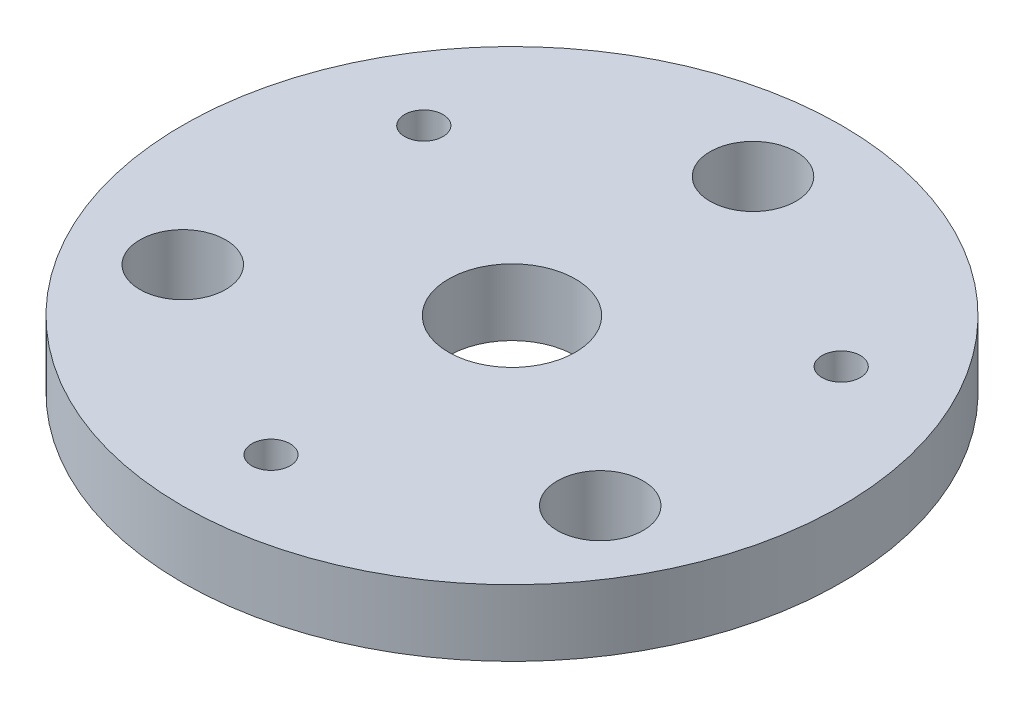
ISO-10303-21;
HEADER;
FILE_DESCRIPTION(('STEP AP214'),'2;1');
FILE_NAME('part.step','',(''),(''),'','','');
FILE_SCHEMA(('AUTOMOTIVE_DESIGN { 1 0 10303 214 1 1 1 1 }'));
ENDSEC;
DATA;
#1=APPLICATION_CONTEXT('core data for automotive mechanical design processes');
#2=APPLICATION_PROTOCOL_DEFINITION('international standard','automotive_design',2000,#1);
#3=PRODUCT_CONTEXT('',#1,'mechanical');
#4=PRODUCT('Part','Part','',(#3));
#5=PRODUCT_RELATED_PRODUCT_CATEGORY('part','',(#4));
#6=PRODUCT_DEFINITION_FORMATION('','',#4);
#7=PRODUCT_DEFINITION_CONTEXT('part definition',#1,'design');
#8=PRODUCT_DEFINITION('design','',#6,#7);
#9=PRODUCT_DEFINITION_SHAPE('','',#8);
#10=(LENGTH_UNIT() NAMED_UNIT(*) SI_UNIT(.MILLI.,.METRE.));
#11=(NAMED_UNIT(*) PLANE_ANGLE_UNIT() SI_UNIT($,.RADIAN.));
#12=(NAMED_UNIT(*) SI_UNIT($,.STERADIAN.) SOLID_ANGLE_UNIT());
#13=UNCERTAINTY_MEASURE_WITH_UNIT(LENGTH_MEASURE(1.E-05),#10,'distance_accuracy_value','');
#14=(GEOMETRIC_REPRESENTATION_CONTEXT(3) GLOBAL_UNCERTAINTY_ASSIGNED_CONTEXT((#13)) GLOBAL_UNIT_ASSIGNED_CONTEXT((#10,
#11,#12)) REPRESENTATION_CONTEXT('',''));
#15=CARTESIAN_POINT('',(0.,0.,0.));
#16=DIRECTION('',(0.,0.,1.));
#17=DIRECTION('',(1.,0.,0.));
#18=AXIS2_PLACEMENT_3D('',#15,#16,#17);
#19=CARTESIAN_POINT('',(0.,3.8989,0.));
#20=DIRECTION('',(0.,1.,0.));
#21=DIRECTION('',(0.,0.,1.));
#22=AXIS2_PLACEMENT_3D('',#19,#20,#21);
#23=PLANE('',#22);
#24=CARTESIAN_POINT('',(24.47925,3.8989,-14.1331015770601));
#25=DIRECTION('',(0.,1.,0.));
#26=DIRECTION('',(0.,0.,1.));
#27=AXIS2_PLACEMENT_3D('',#24,#25,#26);
#28=CIRCLE('',#27,2.2479);
#29=CARTESIAN_POINT('',(24.47925,3.8989,-11.8852015770601));
#30=VERTEX_POINT('',#29);
#31=EDGE_CURVE('E82',#30,#30,#28,.T.);
#32=ORIENTED_EDGE('',*,*,#31,.F.);
#33=EDGE_LOOP('',(#32));
#34=FACE_BOUND('',#33,.T.);
#35=CARTESIAN_POINT('',(0.,3.8989,28.2662031541203));
#36=DIRECTION('',(0.,1.,0.));
#37=DIRECTION('',(0.,0.,1.));
#38=AXIS2_PLACEMENT_3D('',#35,#36,#37);
#39=CIRCLE('',#38,2.2479);
#40=CARTESIAN_POINT('',(0.,3.8989,30.5141031541203));
#41=VERTEX_POINT('',#40);
#42=EDGE_CURVE('E76',#41,#41,#39,.T.);
#43=ORIENTED_EDGE('',*,*,#42,.F.);
#44=EDGE_LOOP('',(#43));
#45=FACE_BOUND('',#44,.T.);
#46=CARTESIAN_POINT('',(-24.47925,3.8989,-14.1331015770602));
#47=DIRECTION('',(0.,1.,0.));
#48=DIRECTION('',(0.,0.,1.));
#49=AXIS2_PLACEMENT_3D('',#46,#47,#48);
#50=CIRCLE('',#49,2.2479);
#51=CARTESIAN_POINT('',(-24.47925,3.8989,-11.8852015770602));
#52=VERTEX_POINT('',#51);
#53=EDGE_CURVE('E70',#52,#52,#50,.T.);
#54=ORIENTED_EDGE('',*,*,#53,.F.);
#55=EDGE_LOOP('',(#54));
#56=FACE_BOUND('',#55,.T.);
#57=CARTESIAN_POINT('',(0.,3.8989,-28.2662031541203));
#58=DIRECTION('',(0.,1.,0.));
#59=DIRECTION('',(0.,0.,1.));
#60=AXIS2_PLACEMENT_3D('',#57,#58,#59);
#61=CIRCLE('',#60,5.0419);
#62=CARTESIAN_POINT('',(0.,3.8989,-23.2243031541203));
#63=VERTEX_POINT('',#62);
#64=EDGE_CURVE('E64',#63,#63,#61,.T.);
#65=ORIENTED_EDGE('',*,*,#64,.F.);
#66=EDGE_LOOP('',(#65));
#67=FACE_BOUND('',#66,.T.);
#68=CARTESIAN_POINT('',(24.47925,3.8989,14.1331015770601));
#69=DIRECTION('',(0.,1.,0.));
#70=DIRECTION('',(0.,0.,1.));
#71=AXIS2_PLACEMENT_3D('',#68,#69,#70);
#72=CIRCLE('',#71,5.0419);
#73=CARTESIAN_POINT('',(24.47925,3.8989,19.1750015770601));
#74=VERTEX_POINT('',#73);
#75=EDGE_CURVE('E58',#74,#74,#72,.T.);
#76=ORIENTED_EDGE('',*,*,#75,.F.);
#77=EDGE_LOOP('',(#76));
#78=FACE_BOUND('',#77,.T.);
#79=CARTESIAN_POINT('',(-24.47925,3.8989,14.1331015770601));
#80=DIRECTION('',(0.,1.,0.));
#81=DIRECTION('',(0.,0.,1.));
#82=AXIS2_PLACEMENT_3D('',#79,#80,#81);
#83=CIRCLE('',#82,5.0419);
#84=CARTESIAN_POINT('',(-24.47925,3.8989,19.1750015770601));
#85=VERTEX_POINT('',#84);
#86=EDGE_CURVE('E52',#85,#85,#83,.T.);
#87=ORIENTED_EDGE('',*,*,#86,.F.);
#88=EDGE_LOOP('',(#87));
#89=FACE_BOUND('',#88,.T.);
#90=CARTESIAN_POINT('',(0.,3.8989,0.));
#91=DIRECTION('',(0.,1.,0.));
#92=DIRECTION('',(0.,0.,1.));
#93=AXIS2_PLACEMENT_3D('',#90,#91,#92);
#94=CIRCLE('',#93,38.65245);
#95=CARTESIAN_POINT('',(0.,3.8989,38.65245));
#96=VERTEX_POINT('',#95);
#97=EDGE_CURVE('E10',#96,#96,#94,.T.);
#98=ORIENTED_EDGE('',*,*,#97,.T.);
#99=EDGE_LOOP('',(#98));
#100=FACE_BOUND('',#99,.T.);
#101=CARTESIAN_POINT('',(0.,3.8989,0.));
#102=DIRECTION('',(0.,1.,0.));
#103=DIRECTION('',(0.,0.,1.));
#104=AXIS2_PLACEMENT_3D('',#101,#102,#103);
#105=CIRCLE('',#104,7.4422);
#106=CARTESIAN_POINT('',(0.,3.8989,7.4422));
#107=VERTEX_POINT('',#106);
#108=EDGE_CURVE('E42',#107,#107,#105,.T.);
#109=ORIENTED_EDGE('',*,*,#108,.F.);
#110=EDGE_LOOP('',(#109));
#111=FACE_BOUND('',#110,.T.);
#112=ADVANCED_FACE('F31',(#34,#45,#56,#67,#78,#89,#100,#111),#23,.T.);
#113=CARTESIAN_POINT('',(0.,-3.8989,0.));
#114=DIRECTION('',(0.,1.,0.));
#115=DIRECTION('',(0.,0.,1.));
#116=AXIS2_PLACEMENT_3D('',#113,#114,#115);
#117=PLANE('',#116);
#118=CARTESIAN_POINT('',(24.47925,-3.8989,-14.1331015770601));
#119=DIRECTION('',(0.,1.,0.));
#120=DIRECTION('',(0.,0.,1.));
#121=AXIS2_PLACEMENT_3D('',#118,#119,#120);
#122=CIRCLE('',#121,2.2479);
#123=CARTESIAN_POINT('',(24.47925,-3.8989,-11.8852015770601));
#124=VERTEX_POINT('',#123);
#125=EDGE_CURVE('E79',#124,#124,#122,.T.);
#126=ORIENTED_EDGE('',*,*,#125,.T.);
#127=EDGE_LOOP('',(#126));
#128=FACE_BOUND('',#127,.T.);
#129=CARTESIAN_POINT('',(0.,-3.8989,28.2662031541203));
#130=DIRECTION('',(0.,1.,0.));
#131=DIRECTION('',(0.,0.,1.));
#132=AXIS2_PLACEMENT_3D('',#129,#130,#131);
#133=CIRCLE('',#132,2.2479);
#134=CARTESIAN_POINT('',(0.,-3.8989,30.5141031541203));
#135=VERTEX_POINT('',#134);
#136=EDGE_CURVE('E73',#135,#135,#133,.T.);
#137=ORIENTED_EDGE('',*,*,#136,.T.);
#138=EDGE_LOOP('',(#137));
#139=FACE_BOUND('',#138,.T.);
#140=CARTESIAN_POINT('',(-24.47925,-3.8989,-14.1331015770602));
#141=DIRECTION('',(0.,1.,0.));
#142=DIRECTION('',(0.,0.,1.));
#143=AXIS2_PLACEMENT_3D('',#140,#141,#142);
#144=CIRCLE('',#143,2.2479);
#145=CARTESIAN_POINT('',(-24.47925,-3.8989,-11.8852015770602));
#146=VERTEX_POINT('',#145);
#147=EDGE_CURVE('E67',#146,#146,#144,.T.);
#148=ORIENTED_EDGE('',*,*,#147,.T.);
#149=EDGE_LOOP('',(#148));
#150=FACE_BOUND('',#149,.T.);
#151=CARTESIAN_POINT('',(0.,-3.8989,-28.2662031541203));
#152=DIRECTION('',(0.,1.,0.));
#153=DIRECTION('',(0.,0.,1.));
#154=AXIS2_PLACEMENT_3D('',#151,#152,#153);
#155=CIRCLE('',#154,5.0419);
#156=CARTESIAN_POINT('',(0.,-3.8989,-23.2243031541203));
#157=VERTEX_POINT('',#156);
#158=EDGE_CURVE('E61',#157,#157,#155,.T.);
#159=ORIENTED_EDGE('',*,*,#158,.T.);
#160=EDGE_LOOP('',(#159));
#161=FACE_BOUND('',#160,.T.);
#162=CARTESIAN_POINT('',(24.47925,-3.8989,14.1331015770601));
#163=DIRECTION('',(0.,1.,0.));
#164=DIRECTION('',(0.,0.,1.));
#165=AXIS2_PLACEMENT_3D('',#162,#163,#164);
#166=CIRCLE('',#165,5.04189999999999);
#167=CARTESIAN_POINT('',(24.47925,-3.8989,19.1750015770601));
#168=VERTEX_POINT('',#167);
#169=EDGE_CURVE('E55',#168,#168,#166,.T.);
#170=ORIENTED_EDGE('',*,*,#169,.T.);
#171=EDGE_LOOP('',(#170));
#172=FACE_BOUND('',#171,.T.);
#173=CARTESIAN_POINT('',(-24.47925,-3.8989,14.1331015770601));
#174=DIRECTION('',(0.,1.,0.));
#175=DIRECTION('',(0.,0.,1.));
#176=AXIS2_PLACEMENT_3D('',#173,#174,#175);
#177=CIRCLE('',#176,5.04189999999999);
#178=CARTESIAN_POINT('',(-24.47925,-3.8989,19.1750015770601));
#179=VERTEX_POINT('',#178);
#180=EDGE_CURVE('E47',#179,#179,#177,.T.);
#181=ORIENTED_EDGE('',*,*,#180,.T.);
#182=EDGE_LOOP('',(#181));
#183=FACE_BOUND('',#182,.T.);
#184=CARTESIAN_POINT('',(0.,-3.8989,0.));
#185=DIRECTION('',(0.,1.,0.));
#186=DIRECTION('',(0.,0.,1.));
#187=AXIS2_PLACEMENT_3D('',#184,#185,#186);
#188=CIRCLE('',#187,38.65245);
#189=CARTESIAN_POINT('',(0.,-3.8989,38.65245));
#190=VERTEX_POINT('',#189);
#191=EDGE_CURVE('E35',#190,#190,#188,.T.);
#192=ORIENTED_EDGE('',*,*,#191,.F.);
#193=EDGE_LOOP('',(#192));
#194=FACE_BOUND('',#193,.T.);
#195=CARTESIAN_POINT('',(0.,-3.8989,0.));
#196=DIRECTION('',(0.,1.,0.));
#197=DIRECTION('',(0.,0.,1.));
#198=AXIS2_PLACEMENT_3D('',#195,#196,#197);
#199=CIRCLE('',#198,7.4422);
#200=CARTESIAN_POINT('',(0.,-3.8989,7.4422));
#201=VERTEX_POINT('',#200);
#202=EDGE_CURVE('E44',#201,#201,#199,.T.);
#203=ORIENTED_EDGE('',*,*,#202,.T.);
#204=EDGE_LOOP('',(#203));
#205=FACE_BOUND('',#204,.T.);
#206=ADVANCED_FACE('F90',(#128,#139,#150,#161,#172,#183,#194,#205),#117,.F.);
#207=CARTESIAN_POINT('',(0.,3.8989,0.));
#208=DIRECTION('',(0.,-1.,0.));
#209=DIRECTION('',(0.,0.,-1.));
#210=AXIS2_PLACEMENT_3D('',#207,#208,#209);
#211=CYLINDRICAL_SURFACE('',#210,38.65245);
#212=ORIENTED_EDGE('',*,*,#97,.F.);
#213=EDGE_LOOP('',(#212));
#214=FACE_BOUND('',#213,.T.);
#215=ORIENTED_EDGE('',*,*,#191,.T.);
#216=EDGE_LOOP('',(#215));
#217=FACE_BOUND('',#216,.T.);
#218=ADVANCED_FACE('F33',(#214,#217),#211,.T.);
#219=CARTESIAN_POINT('',(0.,3.8989,0.));
#220=DIRECTION('',(0.,-1.,0.));
#221=DIRECTION('',(0.,0.,-1.));
#222=AXIS2_PLACEMENT_3D('',#219,#220,#221);
#223=CYLINDRICAL_SURFACE('',#222,7.4422);
#224=ORIENTED_EDGE('',*,*,#108,.T.);
#225=EDGE_LOOP('',(#224));
#226=FACE_BOUND('',#225,.T.);
#227=ORIENTED_EDGE('',*,*,#202,.F.);
#228=EDGE_LOOP('',(#227));
#229=FACE_BOUND('',#228,.T.);
#230=ADVANCED_FACE('F104',(#226,#229),#223,.F.);
#231=CARTESIAN_POINT('',(-24.47925,3.8989,14.1331015770601));
#232=DIRECTION('',(0.,1.,0.));
#233=DIRECTION('',(0.,0.,1.));
#234=AXIS2_PLACEMENT_3D('',#231,#232,#233);
#235=CYLINDRICAL_SURFACE('',#234,5.0419);
#236=ORIENTED_EDGE('',*,*,#180,.F.);
#237=EDGE_LOOP('',(#236));
#238=FACE_BOUND('',#237,.T.);
#239=ORIENTED_EDGE('',*,*,#86,.T.);
#240=EDGE_LOOP('',(#239));
#241=FACE_BOUND('',#240,.T.);
#242=ADVANCED_FACE('F107',(#238,#241),#235,.F.);
#243=CARTESIAN_POINT('',(24.47925,3.8989,14.1331015770601));
#244=DIRECTION('',(0.,1.,0.));
#245=DIRECTION('',(0.,0.,1.));
#246=AXIS2_PLACEMENT_3D('',#243,#244,#245);
#247=CYLINDRICAL_SURFACE('',#246,5.0419);
#248=ORIENTED_EDGE('',*,*,#169,.F.);
#249=EDGE_LOOP('',(#248));
#250=FACE_BOUND('',#249,.T.);
#251=ORIENTED_EDGE('',*,*,#75,.T.);
#252=EDGE_LOOP('',(#251));
#253=FACE_BOUND('',#252,.T.);
#254=ADVANCED_FACE('F121',(#250,#253),#247,.F.);
#255=CARTESIAN_POINT('',(0.,3.8989,-28.2662031541203));
#256=DIRECTION('',(0.,1.,0.));
#257=DIRECTION('',(0.,0.,1.));
#258=AXIS2_PLACEMENT_3D('',#255,#256,#257);
#259=CYLINDRICAL_SURFACE('',#258,5.0419);
#260=ORIENTED_EDGE('',*,*,#158,.F.);
#261=EDGE_LOOP('',(#260));
#262=FACE_BOUND('',#261,.T.);
#263=ORIENTED_EDGE('',*,*,#64,.T.);
#264=EDGE_LOOP('',(#263));
#265=FACE_BOUND('',#264,.T.);
#266=ADVANCED_FACE('F125',(#262,#265),#259,.F.);
#267=CARTESIAN_POINT('',(-24.47925,3.8989,-14.1331015770602));
#268=DIRECTION('',(0.,1.,0.));
#269=DIRECTION('',(0.,0.,1.));
#270=AXIS2_PLACEMENT_3D('',#267,#268,#269);
#271=CYLINDRICAL_SURFACE('',#270,2.2479);
#272=ORIENTED_EDGE('',*,*,#147,.F.);
#273=EDGE_LOOP('',(#272));
#274=FACE_BOUND('',#273,.T.);
#275=ORIENTED_EDGE('',*,*,#53,.T.);
#276=EDGE_LOOP('',(#275));
#277=FACE_BOUND('',#276,.T.);
#278=ADVANCED_FACE('F129',(#274,#277),#271,.F.);
#279=CARTESIAN_POINT('',(0.,3.8989,28.2662031541203));
#280=DIRECTION('',(0.,1.,0.));
#281=DIRECTION('',(0.,0.,1.));
#282=AXIS2_PLACEMENT_3D('',#279,#280,#281);
#283=CYLINDRICAL_SURFACE('',#282,2.2479);
#284=ORIENTED_EDGE('',*,*,#136,.F.);
#285=EDGE_LOOP('',(#284));
#286=FACE_BOUND('',#285,.T.);
#287=ORIENTED_EDGE('',*,*,#42,.T.);
#288=EDGE_LOOP('',(#287));
#289=FACE_BOUND('',#288,.T.);
#290=ADVANCED_FACE('F133',(#286,#289),#283,.F.);
#291=CARTESIAN_POINT('',(24.47925,3.8989,-14.1331015770601));
#292=DIRECTION('',(0.,1.,0.));
#293=DIRECTION('',(0.,0.,1.));
#294=AXIS2_PLACEMENT_3D('',#291,#292,#293);
#295=CYLINDRICAL_SURFACE('',#294,2.2479);
#296=ORIENTED_EDGE('',*,*,#125,.F.);
#297=EDGE_LOOP('',(#296));
#298=FACE_BOUND('',#297,.T.);
#299=ORIENTED_EDGE('',*,*,#31,.T.);
#300=EDGE_LOOP('',(#299));
#301=FACE_BOUND('',#300,.T.);
#302=ADVANCED_FACE('F86',(#298,#301),#295,.F.);
#303=CLOSED_SHELL('',(#112,#206,#218,#230,#242,#254,#266,#278,#290,#302));
#304=MANIFOLD_SOLID_BREP('B2',#303);
#305=ADVANCED_BREP_SHAPE_REPRESENTATION('',(#18,#304),#14);
#306=SHAPE_DEFINITION_REPRESENTATION(#9,#305);
ENDSEC;
END-ISO-10303-21;
